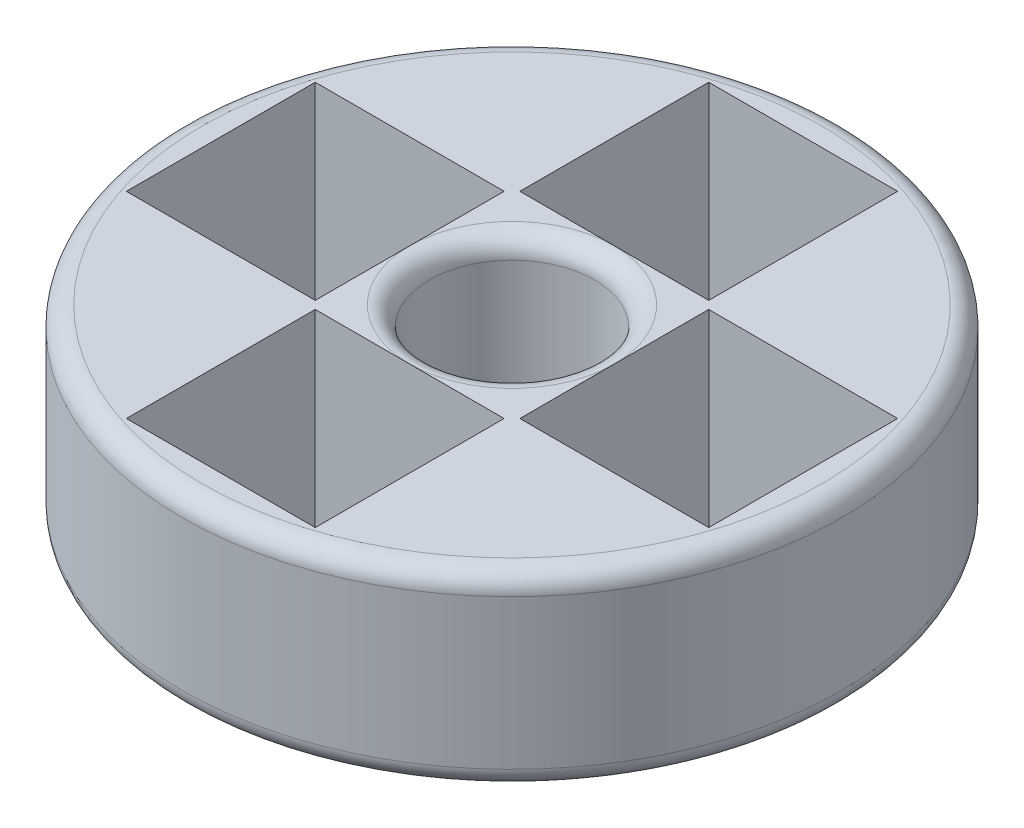
ISO-10303-21;
HEADER;
FILE_DESCRIPTION(('STEP AP214'),'2;1');
FILE_NAME('part.step','',(''),(''),'','','');
FILE_SCHEMA(('AUTOMOTIVE_DESIGN { 1 0 10303 214 1 1 1 1 }'));
ENDSEC;
DATA;
#1=APPLICATION_CONTEXT('core data for automotive mechanical design processes');
#2=APPLICATION_PROTOCOL_DEFINITION('international standard','automotive_design',2000,#1);
#3=PRODUCT_CONTEXT('',#1,'mechanical');
#4=PRODUCT('Part','Part','',(#3));
#5=PRODUCT_RELATED_PRODUCT_CATEGORY('part','',(#4));
#6=PRODUCT_DEFINITION_FORMATION('','',#4);
#7=PRODUCT_DEFINITION_CONTEXT('part definition',#1,'design');
#8=PRODUCT_DEFINITION('design','',#6,#7);
#9=PRODUCT_DEFINITION_SHAPE('','',#8);
#10=(LENGTH_UNIT() NAMED_UNIT(*) SI_UNIT(.MILLI.,.METRE.));
#11=(NAMED_UNIT(*) PLANE_ANGLE_UNIT() SI_UNIT($,.RADIAN.));
#12=(NAMED_UNIT(*) SI_UNIT($,.STERADIAN.) SOLID_ANGLE_UNIT());
#13=UNCERTAINTY_MEASURE_WITH_UNIT(LENGTH_MEASURE(1.E-05),#10,'distance_accuracy_value','');
#14=(GEOMETRIC_REPRESENTATION_CONTEXT(3) GLOBAL_UNCERTAINTY_ASSIGNED_CONTEXT((#13)) GLOBAL_UNIT_ASSIGNED_CONTEXT((#10,
#11,#12)) REPRESENTATION_CONTEXT('',''));
#15=CARTESIAN_POINT('',(0.,0.,0.));
#16=DIRECTION('',(0.,0.,1.));
#17=DIRECTION('',(1.,0.,0.));
#18=AXIS2_PLACEMENT_3D('',#15,#16,#17);
#19=CARTESIAN_POINT('',(0.,9.6,0.));
#20=DIRECTION('',(0.,1.,0.));
#21=DIRECTION('',(0.,0.,1.));
#22=AXIS2_PLACEMENT_3D('',#19,#20,#21);
#23=PLANE('',#22);
#24=CARTESIAN_POINT('',(0.,9.6,0.));
#25=DIRECTION('',(0.,1.,0.));
#26=DIRECTION('',(0.,0.,1.));
#27=AXIS2_PLACEMENT_3D('',#24,#25,#26);
#28=CIRCLE('',#27,15.75);
#29=CARTESIAN_POINT('',(0.,9.6,15.75));
#30=VERTEX_POINT('',#29);
#31=EDGE_CURVE('E336',#30,#30,#28,.T.);
#32=ORIENTED_EDGE('',*,*,#31,.T.);
#33=EDGE_LOOP('',(#32));
#34=FACE_BOUND('',#33,.T.);
#35=DIRECTION('',(-1.,0.,0.));
#36=VECTOR('',#35,1.);
#37=CARTESIAN_POINT('',(4.80000000000057,9.6,5.19999999999973));
#38=LINE('',#37,#36);
#39=CARTESIAN_POINT('',(0.,9.6,5.19999999999973));
#40=VERTEX_POINT('',#39);
#41=CARTESIAN_POINT('',(-4.79999999999943,9.6,5.19999999999973));
#42=VERTEX_POINT('',#41);
#43=EDGE_CURVE('E222',#40,#42,#38,.T.);
#44=ORIENTED_EDGE('',*,*,#43,.F.);
#45=CARTESIAN_POINT('',(0.,9.6,0.));
#46=DIRECTION('',(0.,1.,0.));
#47=DIRECTION('',(0.,0.,1.));
#48=AXIS2_PLACEMENT_3D('',#45,#46,#47);
#49=CIRCLE('',#48,5.2);
#50=CARTESIAN_POINT('',(-5.19999999999958,9.6,0.));
#51=VERTEX_POINT('',#50);
#52=EDGE_CURVE('E343',#40,#51,#49,.F.);
#53=ORIENTED_EDGE('',*,*,#52,.T.);
#54=DIRECTION('',(0.,0.,-1.));
#55=VECTOR('',#54,1.);
#56=CARTESIAN_POINT('',(-5.19999999999958,9.6,4.80000000000015));
#57=LINE('',#56,#55);
#58=CARTESIAN_POINT('',(-5.19999999999958,9.6,4.80000000000015));
#59=VERTEX_POINT('',#58);
#60=EDGE_CURVE('E196',#59,#51,#57,.T.);
#61=ORIENTED_EDGE('',*,*,#60,.F.);
#62=DIRECTION('',(1.,0.,0.));
#63=VECTOR('',#62,1.);
#64=CARTESIAN_POINT('',(-5.19999999999958,9.6,4.80000000000015));
#65=LINE('',#64,#63);
#66=CARTESIAN_POINT('',(-14.7999999999996,9.6,4.80000000000015));
#67=VERTEX_POINT('',#66);
#68=EDGE_CURVE('E183',#67,#59,#65,.T.);
#69=ORIENTED_EDGE('',*,*,#68,.F.);
#70=DIRECTION('',(0.,0.,1.));
#71=VECTOR('',#70,1.);
#72=CARTESIAN_POINT('',(-14.7999999999996,9.6,4.80000000000015));
#73=LINE('',#72,#71);
#74=CARTESIAN_POINT('',(-14.7999999999996,9.6,-4.79999999999985));
#75=VERTEX_POINT('',#74);
#76=EDGE_CURVE('E174',#75,#67,#73,.T.);
#77=ORIENTED_EDGE('',*,*,#76,.F.);
#78=DIRECTION('',(-1.,0.,0.));
#79=VECTOR('',#78,1.);
#80=CARTESIAN_POINT('',(-5.19999999999958,9.6,-4.79999999999985));
#81=LINE('',#80,#79);
#82=CARTESIAN_POINT('',(-5.19999999999958,9.6,-4.79999999999985));
#83=VERTEX_POINT('',#82);
#84=EDGE_CURVE('E201',#83,#75,#81,.T.);
#85=ORIENTED_EDGE('',*,*,#84,.F.);
#86=EDGE_CURVE('E197',#51,#83,#57,.T.);
#87=ORIENTED_EDGE('',*,*,#86,.F.);
#88=CARTESIAN_POINT('',(0.,9.6,0.));
#89=DIRECTION('',(0.,1.,0.));
#90=DIRECTION('',(0.,0.,1.));
#91=AXIS2_PLACEMENT_3D('',#88,#89,#90);
#92=CIRCLE('',#91,5.2);
#93=CARTESIAN_POINT('',(0.,9.6,-5.2));
#94=VERTEX_POINT('',#93);
#95=EDGE_CURVE('E48',#51,#94,#92,.F.);
#96=ORIENTED_EDGE('',*,*,#95,.T.);
#97=DIRECTION('',(1.,0.,0.));
#98=VECTOR('',#97,1.);
#99=CARTESIAN_POINT('',(-4.8,9.6,-5.2));
#100=LINE('',#99,#98);
#101=CARTESIAN_POINT('',(-4.8,9.6,-5.2));
#102=VERTEX_POINT('',#101);
#103=EDGE_CURVE('E294',#102,#94,#100,.T.);
#104=ORIENTED_EDGE('',*,*,#103,.F.);
#105=DIRECTION('',(0.,0.,1.));
#106=VECTOR('',#105,1.);
#107=CARTESIAN_POINT('',(-4.8,9.6,-5.2));
#108=LINE('',#107,#106);
#109=CARTESIAN_POINT('',(-4.8,9.6,-14.8));
#110=VERTEX_POINT('',#109);
#111=EDGE_CURVE('E290',#110,#102,#108,.T.);
#112=ORIENTED_EDGE('',*,*,#111,.F.);
#113=DIRECTION('',(-1.,0.,0.));
#114=VECTOR('',#113,1.);
#115=CARTESIAN_POINT('',(-4.8,9.6,-14.8));
#116=LINE('',#115,#114);
#117=CARTESIAN_POINT('',(4.8,9.6,-14.8));
#118=VERTEX_POINT('',#117);
#119=EDGE_CURVE('E287',#118,#110,#116,.T.);
#120=ORIENTED_EDGE('',*,*,#119,.F.);
#121=DIRECTION('',(0.,0.,-1.));
#122=VECTOR('',#121,1.);
#123=CARTESIAN_POINT('',(4.8,9.6,-5.2));
#124=LINE('',#123,#122);
#125=CARTESIAN_POINT('',(4.8,9.6,-5.2));
#126=VERTEX_POINT('',#125);
#127=EDGE_CURVE('E285',#126,#118,#124,.T.);
#128=ORIENTED_EDGE('',*,*,#127,.F.);
#129=EDGE_CURVE('E293',#94,#126,#100,.T.);
#130=ORIENTED_EDGE('',*,*,#129,.F.);
#131=CARTESIAN_POINT('',(0.,9.6,0.));
#132=DIRECTION('',(0.,1.,0.));
#133=DIRECTION('',(0.,0.,1.));
#134=AXIS2_PLACEMENT_3D('',#131,#132,#133);
#135=CIRCLE('',#134,5.2);
#136=CARTESIAN_POINT('',(5.20000000000015,9.6,0.));
#137=VERTEX_POINT('',#136);
#138=EDGE_CURVE('E340',#94,#137,#135,.F.);
#139=ORIENTED_EDGE('',*,*,#138,.T.);
#140=DIRECTION('',(0.,0.,1.));
#141=VECTOR('',#140,1.);
#142=CARTESIAN_POINT('',(5.20000000000015,9.6,-4.80000000000042));
#143=LINE('',#142,#141);
#144=CARTESIAN_POINT('',(5.20000000000015,9.6,-4.80000000000042));
#145=VERTEX_POINT('',#144);
#146=EDGE_CURVE('E257',#145,#137,#143,.T.);
#147=ORIENTED_EDGE('',*,*,#146,.F.);
#148=DIRECTION('',(-1.,0.,0.));
#149=VECTOR('',#148,1.);
#150=CARTESIAN_POINT('',(5.20000000000015,9.6,-4.80000000000042));
#151=LINE('',#150,#149);
#152=CARTESIAN_POINT('',(14.8000000000001,9.6,-4.80000000000042));
#153=VERTEX_POINT('',#152);
#154=EDGE_CURVE('E253',#153,#145,#151,.T.);
#155=ORIENTED_EDGE('',*,*,#154,.F.);
#156=DIRECTION('',(0.,0.,-1.));
#157=VECTOR('',#156,1.);
#158=CARTESIAN_POINT('',(14.8000000000001,9.6,-4.80000000000042));
#159=LINE('',#158,#157);
#160=CARTESIAN_POINT('',(14.8000000000001,9.6,4.79999999999958));
#161=VERTEX_POINT('',#160);
#162=EDGE_CURVE('E251',#161,#153,#159,.T.);
#163=ORIENTED_EDGE('',*,*,#162,.F.);
#164=DIRECTION('',(1.,0.,0.));
#165=VECTOR('',#164,1.);
#166=CARTESIAN_POINT('',(5.20000000000015,9.6,4.79999999999958));
#167=LINE('',#166,#165);
#168=CARTESIAN_POINT('',(5.20000000000015,9.6,4.79999999999958));
#169=VERTEX_POINT('',#168);
#170=EDGE_CURVE('E260',#169,#161,#167,.T.);
#171=ORIENTED_EDGE('',*,*,#170,.F.);
#172=EDGE_CURVE('E256',#137,#169,#143,.T.);
#173=ORIENTED_EDGE('',*,*,#172,.F.);
#174=CARTESIAN_POINT('',(0.,9.6,0.));
#175=DIRECTION('',(0.,1.,0.));
#176=DIRECTION('',(0.,0.,1.));
#177=AXIS2_PLACEMENT_3D('',#174,#175,#176);
#178=CIRCLE('',#177,5.2);
#179=EDGE_CURVE('E56',#137,#40,#178,.F.);
#180=ORIENTED_EDGE('',*,*,#179,.T.);
#181=CARTESIAN_POINT('',(4.80000000000057,9.6,5.19999999999973));
#182=VERTEX_POINT('',#181);
#183=EDGE_CURVE('E223',#182,#40,#38,.T.);
#184=ORIENTED_EDGE('',*,*,#183,.F.);
#185=DIRECTION('',(0.,0.,-1.));
#186=VECTOR('',#185,1.);
#187=CARTESIAN_POINT('',(4.80000000000057,9.6,5.19999999999973));
#188=LINE('',#187,#186);
#189=CARTESIAN_POINT('',(4.80000000000057,9.6,14.7999999999997));
#190=VERTEX_POINT('',#189);
#191=EDGE_CURVE('E219',#190,#182,#188,.T.);
#192=ORIENTED_EDGE('',*,*,#191,.F.);
#193=DIRECTION('',(1.,0.,0.));
#194=VECTOR('',#193,1.);
#195=CARTESIAN_POINT('',(4.80000000000057,9.6,14.7999999999997));
#196=LINE('',#195,#194);
#197=CARTESIAN_POINT('',(-4.79999999999943,9.6,14.7999999999997));
#198=VERTEX_POINT('',#197);
#199=EDGE_CURVE('E217',#198,#190,#196,.T.);
#200=ORIENTED_EDGE('',*,*,#199,.F.);
#201=DIRECTION('',(0.,0.,1.));
#202=VECTOR('',#201,1.);
#203=CARTESIAN_POINT('',(-4.79999999999943,9.6,5.19999999999973));
#204=LINE('',#203,#202);
#205=EDGE_CURVE('E226',#42,#198,#204,.T.);
#206=ORIENTED_EDGE('',*,*,#205,.F.);
#207=EDGE_LOOP('',(#44,#53,#61,#69,#77,#85,#87,#96,#104,#112,#120,#128,#130,#139,#147,#155,#163,
#171,#173,#180,#184,#192,#200,#206));
#208=FACE_BOUND('',#207,.T.);
#209=ADVANCED_FACE('F33',(#34,#208),#23,.T.);
#210=CARTESIAN_POINT('',(0.,0.,0.));
#211=DIRECTION('',(0.,1.,0.));
#212=DIRECTION('',(0.,0.,1.));
#213=AXIS2_PLACEMENT_3D('',#210,#211,#212);
#214=PLANE('',#213);
#215=CARTESIAN_POINT('',(0.,0.,0.));
#216=DIRECTION('',(0.,1.,0.));
#217=DIRECTION('',(0.,0.,1.));
#218=AXIS2_PLACEMENT_3D('',#215,#216,#217);
#219=CIRCLE('',#218,15.75);
#220=CARTESIAN_POINT('',(0.,0.,15.75));
#221=VERTEX_POINT('',#220);
#222=EDGE_CURVE('E318',#221,#221,#219,.F.);
#223=ORIENTED_EDGE('',*,*,#222,.T.);
#224=EDGE_LOOP('',(#223));
#225=FACE_BOUND('',#224,.T.);
#226=DIRECTION('',(-1.,0.,0.));
#227=VECTOR('',#226,1.);
#228=CARTESIAN_POINT('',(4.80000000000057,0.,5.19999999999973));
#229=LINE('',#228,#227);
#230=CARTESIAN_POINT('',(4.80000000000057,0.,5.19999999999973));
#231=VERTEX_POINT('',#230);
#232=CARTESIAN_POINT('',(0.,0.,5.19999999999973));
#233=VERTEX_POINT('',#232);
#234=EDGE_CURVE('E235',#231,#233,#229,.T.);
#235=ORIENTED_EDGE('',*,*,#234,.T.);
#236=CARTESIAN_POINT('',(0.,0.,0.));
#237=DIRECTION('',(0.,1.,0.));
#238=DIRECTION('',(0.,0.,1.));
#239=AXIS2_PLACEMENT_3D('',#236,#237,#238);
#240=CIRCLE('',#239,5.2);
#241=CARTESIAN_POINT('',(5.20000000000015,0.,0.));
#242=VERTEX_POINT('',#241);
#243=EDGE_CURVE('E327',#233,#242,#240,.T.);
#244=ORIENTED_EDGE('',*,*,#243,.T.);
#245=DIRECTION('',(0.,0.,1.));
#246=VECTOR('',#245,1.);
#247=CARTESIAN_POINT('',(5.20000000000015,0.,-4.80000000000042));
#248=LINE('',#247,#246);
#249=CARTESIAN_POINT('',(5.20000000000015,0.,4.79999999999958));
#250=VERTEX_POINT('',#249);
#251=EDGE_CURVE('E268',#242,#250,#248,.T.);
#252=ORIENTED_EDGE('',*,*,#251,.T.);
#253=DIRECTION('',(1.,0.,0.));
#254=VECTOR('',#253,1.);
#255=CARTESIAN_POINT('',(5.20000000000015,0.,4.79999999999958));
#256=LINE('',#255,#254);
#257=CARTESIAN_POINT('',(14.8000000000001,0.,4.79999999999958));
#258=VERTEX_POINT('',#257);
#259=EDGE_CURVE('E254',#250,#258,#256,.T.);
#260=ORIENTED_EDGE('',*,*,#259,.T.);
#261=DIRECTION('',(0.,0.,-1.));
#262=VECTOR('',#261,1.);
#263=CARTESIAN_POINT('',(14.8000000000001,0.,-4.80000000000042));
#264=LINE('',#263,#262);
#265=CARTESIAN_POINT('',(14.8000000000001,0.,-4.80000000000042));
#266=VERTEX_POINT('',#265);
#267=EDGE_CURVE('E250',#258,#266,#264,.T.);
#268=ORIENTED_EDGE('',*,*,#267,.T.);
#269=DIRECTION('',(-1.,0.,0.));
#270=VECTOR('',#269,1.);
#271=CARTESIAN_POINT('',(5.20000000000015,0.,-4.80000000000042));
#272=LINE('',#271,#270);
#273=CARTESIAN_POINT('',(5.20000000000015,0.,-4.80000000000042));
#274=VERTEX_POINT('',#273);
#275=EDGE_CURVE('E265',#266,#274,#272,.T.);
#276=ORIENTED_EDGE('',*,*,#275,.T.);
#277=EDGE_CURVE('E269',#274,#242,#248,.T.);
#278=ORIENTED_EDGE('',*,*,#277,.T.);
#279=CARTESIAN_POINT('',(0.,0.,0.));
#280=DIRECTION('',(0.,1.,0.));
#281=DIRECTION('',(0.,0.,1.));
#282=AXIS2_PLACEMENT_3D('',#279,#280,#281);
#283=CIRCLE('',#282,5.2);
#284=CARTESIAN_POINT('',(0.,0.,-5.2));
#285=VERTEX_POINT('',#284);
#286=EDGE_CURVE('E325',#242,#285,#283,.T.);
#287=ORIENTED_EDGE('',*,*,#286,.T.);
#288=DIRECTION('',(1.,0.,0.));
#289=VECTOR('',#288,1.);
#290=CARTESIAN_POINT('',(-4.8,0.,-5.2));
#291=LINE('',#290,#289);
#292=CARTESIAN_POINT('',(4.8,0.,-5.2));
#293=VERTEX_POINT('',#292);
#294=EDGE_CURVE('E306',#285,#293,#291,.T.);
#295=ORIENTED_EDGE('',*,*,#294,.T.);
#296=DIRECTION('',(0.,0.,-1.));
#297=VECTOR('',#296,1.);
#298=CARTESIAN_POINT('',(4.8,0.,-5.2));
#299=LINE('',#298,#297);
#300=CARTESIAN_POINT('',(4.8,0.,-14.8));
#301=VERTEX_POINT('',#300);
#302=EDGE_CURVE('E284',#293,#301,#299,.T.);
#303=ORIENTED_EDGE('',*,*,#302,.T.);
#304=DIRECTION('',(-1.,0.,0.));
#305=VECTOR('',#304,1.);
#306=CARTESIAN_POINT('',(-4.8,0.,-14.8));
#307=LINE('',#306,#305);
#308=CARTESIAN_POINT('',(-4.8,0.,-14.8));
#309=VERTEX_POINT('',#308);
#310=EDGE_CURVE('E300',#301,#309,#307,.T.);
#311=ORIENTED_EDGE('',*,*,#310,.T.);
#312=DIRECTION('',(0.,0.,1.));
#313=VECTOR('',#312,1.);
#314=CARTESIAN_POINT('',(-4.8,0.,-5.2));
#315=LINE('',#314,#313);
#316=CARTESIAN_POINT('',(-4.8,0.,-5.2));
#317=VERTEX_POINT('',#316);
#318=EDGE_CURVE('E303',#309,#317,#315,.T.);
#319=ORIENTED_EDGE('',*,*,#318,.T.);
#320=EDGE_CURVE('E288',#317,#285,#291,.T.);
#321=ORIENTED_EDGE('',*,*,#320,.T.);
#322=CARTESIAN_POINT('',(0.,0.,0.));
#323=DIRECTION('',(0.,1.,0.));
#324=DIRECTION('',(0.,0.,1.));
#325=AXIS2_PLACEMENT_3D('',#322,#323,#324);
#326=CIRCLE('',#325,5.2);
#327=CARTESIAN_POINT('',(-5.19999999999958,0.,0.));
#328=VERTEX_POINT('',#327);
#329=EDGE_CURVE('E323',#285,#328,#326,.T.);
#330=ORIENTED_EDGE('',*,*,#329,.T.);
#331=DIRECTION('',(0.,0.,-1.));
#332=VECTOR('',#331,1.);
#333=CARTESIAN_POINT('',(-5.19999999999958,0.,4.80000000000015));
#334=LINE('',#333,#332);
#335=CARTESIAN_POINT('',(-5.19999999999958,0.,-4.79999999999985));
#336=VERTEX_POINT('',#335);
#337=EDGE_CURVE('E206',#328,#336,#334,.T.);
#338=ORIENTED_EDGE('',*,*,#337,.T.);
#339=DIRECTION('',(-1.,0.,0.));
#340=VECTOR('',#339,1.);
#341=CARTESIAN_POINT('',(-5.19999999999958,0.,-4.79999999999985));
#342=LINE('',#341,#340);
#343=CARTESIAN_POINT('',(-14.7999999999996,0.,-4.79999999999985));
#344=VERTEX_POINT('',#343);
#345=EDGE_CURVE('E184',#336,#344,#342,.T.);
#346=ORIENTED_EDGE('',*,*,#345,.T.);
#347=DIRECTION('',(0.,0.,1.));
#348=VECTOR('',#347,1.);
#349=CARTESIAN_POINT('',(-14.7999999999996,0.,4.80000000000015));
#350=LINE('',#349,#348);
#351=CARTESIAN_POINT('',(-14.7999999999996,0.,4.80000000000015));
#352=VERTEX_POINT('',#351);
#353=EDGE_CURVE('E203',#344,#352,#350,.T.);
#354=ORIENTED_EDGE('',*,*,#353,.T.);
#355=DIRECTION('',(1.,0.,0.));
#356=VECTOR('',#355,1.);
#357=CARTESIAN_POINT('',(-5.19999999999958,0.,4.80000000000015));
#358=LINE('',#357,#356);
#359=CARTESIAN_POINT('',(-5.19999999999958,0.,4.80000000000015));
#360=VERTEX_POINT('',#359);
#361=EDGE_CURVE('E190',#352,#360,#358,.T.);
#362=ORIENTED_EDGE('',*,*,#361,.T.);
#363=EDGE_CURVE('E207',#360,#328,#334,.T.);
#364=ORIENTED_EDGE('',*,*,#363,.T.);
#365=CARTESIAN_POINT('',(0.,0.,0.));
#366=DIRECTION('',(0.,1.,0.));
#367=DIRECTION('',(0.,0.,1.));
#368=AXIS2_PLACEMENT_3D('',#365,#366,#367);
#369=CIRCLE('',#368,5.2);
#370=EDGE_CURVE('E321',#328,#233,#369,.T.);
#371=ORIENTED_EDGE('',*,*,#370,.T.);
#372=CARTESIAN_POINT('',(-4.79999999999943,0.,5.19999999999973));
#373=VERTEX_POINT('',#372);
#374=EDGE_CURVE('E234',#233,#373,#229,.T.);
#375=ORIENTED_EDGE('',*,*,#374,.T.);
#376=DIRECTION('',(0.,0.,1.));
#377=VECTOR('',#376,1.);
#378=CARTESIAN_POINT('',(-4.79999999999943,0.,5.19999999999973));
#379=LINE('',#378,#377);
#380=CARTESIAN_POINT('',(-4.79999999999943,0.,14.7999999999997));
#381=VERTEX_POINT('',#380);
#382=EDGE_CURVE('E220',#373,#381,#379,.T.);
#383=ORIENTED_EDGE('',*,*,#382,.T.);
#384=DIRECTION('',(1.,0.,0.));
#385=VECTOR('',#384,1.);
#386=CARTESIAN_POINT('',(4.80000000000057,0.,14.7999999999997));
#387=LINE('',#386,#385);
#388=CARTESIAN_POINT('',(4.80000000000057,0.,14.7999999999997));
#389=VERTEX_POINT('',#388);
#390=EDGE_CURVE('E191',#381,#389,#387,.T.);
#391=ORIENTED_EDGE('',*,*,#390,.T.);
#392=DIRECTION('',(0.,0.,-1.));
#393=VECTOR('',#392,1.);
#394=CARTESIAN_POINT('',(4.80000000000057,0.,5.19999999999973));
#395=LINE('',#394,#393);
#396=EDGE_CURVE('E231',#389,#231,#395,.T.);
#397=ORIENTED_EDGE('',*,*,#396,.T.);
#398=EDGE_LOOP('',(#235,#244,#252,#260,#268,#276,#278,#287,#295,#303,#311,#319,#321,#330,#338,
#346,#354,#362,#364,#371,#375,#383,#391,#397));
#399=FACE_BOUND('',#398,.T.);
#400=ADVANCED_FACE('F355',(#225,#399),#214,.F.);
#401=CARTESIAN_POINT('',(0.,9.6,0.));
#402=DIRECTION('',(0.,-1.,0.));
#403=DIRECTION('',(0.,0.,-1.));
#404=AXIS2_PLACEMENT_3D('',#401,#402,#403);
#405=CYLINDRICAL_SURFACE('',#404,16.75);
#406=CARTESIAN_POINT('',(0.,0.999999999999999,0.));
#407=DIRECTION('',(0.,1.,0.));
#408=DIRECTION('',(0.,0.,1.));
#409=AXIS2_PLACEMENT_3D('',#406,#407,#408);
#410=CIRCLE('',#409,16.75);
#411=CARTESIAN_POINT('',(0.,0.999999999999999,16.75));
#412=VERTEX_POINT('',#411);
#413=EDGE_CURVE('E11',#412,#412,#410,.T.);
#414=ORIENTED_EDGE('',*,*,#413,.T.);
#415=EDGE_LOOP('',(#414));
#416=FACE_BOUND('',#415,.T.);
#417=CARTESIAN_POINT('',(0.,8.6,0.));
#418=DIRECTION('',(0.,1.,0.));
#419=DIRECTION('',(0.,0.,1.));
#420=AXIS2_PLACEMENT_3D('',#417,#418,#419);
#421=CIRCLE('',#420,16.75);
#422=CARTESIAN_POINT('',(0.,8.6,16.75));
#423=VERTEX_POINT('',#422);
#424=EDGE_CURVE('E41',#423,#423,#421,.F.);
#425=ORIENTED_EDGE('',*,*,#424,.T.);
#426=EDGE_LOOP('',(#425));
#427=FACE_BOUND('',#426,.T.);
#428=ADVANCED_FACE('F347',(#416,#427),#405,.T.);
#429=CARTESIAN_POINT('',(4.8,9.6,-5.2));
#430=DIRECTION('',(-1.,0.,0.));
#431=DIRECTION('',(0.,0.,1.));
#432=AXIS2_PLACEMENT_3D('',#429,#430,#431);
#433=PLANE('',#432);
#434=ORIENTED_EDGE('',*,*,#302,.F.);
#435=DIRECTION('',(0.,-1.,0.));
#436=VECTOR('',#435,1.);
#437=CARTESIAN_POINT('',(4.8,9.6,-5.2));
#438=LINE('',#437,#436);
#439=EDGE_CURVE('E297',#126,#293,#438,.T.);
#440=ORIENTED_EDGE('',*,*,#439,.F.);
#441=ORIENTED_EDGE('',*,*,#127,.T.);
#442=DIRECTION('',(0.,-1.,0.));
#443=VECTOR('',#442,1.);
#444=CARTESIAN_POINT('',(4.8,9.6,-14.8));
#445=LINE('',#444,#443);
#446=EDGE_CURVE('E315',#118,#301,#445,.T.);
#447=ORIENTED_EDGE('',*,*,#446,.T.);
#448=EDGE_LOOP('',(#434,#440,#441,#447));
#449=FACE_BOUND('',#448,.T.);
#450=ADVANCED_FACE('F363',(#449),#433,.T.);
#451=CARTESIAN_POINT('',(-4.8,9.6,-14.8));
#452=DIRECTION('',(0.,0.,1.));
#453=DIRECTION('',(1.,0.,0.));
#454=AXIS2_PLACEMENT_3D('',#451,#452,#453);
#455=PLANE('',#454);
#456=ORIENTED_EDGE('',*,*,#310,.F.);
#457=ORIENTED_EDGE('',*,*,#446,.F.);
#458=ORIENTED_EDGE('',*,*,#119,.T.);
#459=DIRECTION('',(0.,-1.,0.));
#460=VECTOR('',#459,1.);
#461=CARTESIAN_POINT('',(-4.8,9.6,-14.8));
#462=LINE('',#461,#460);
#463=EDGE_CURVE('E313',#110,#309,#462,.T.);
#464=ORIENTED_EDGE('',*,*,#463,.T.);
#465=EDGE_LOOP('',(#456,#457,#458,#464));
#466=FACE_BOUND('',#465,.T.);
#467=ADVANCED_FACE('F451',(#466),#455,.T.);
#468=CARTESIAN_POINT('',(-4.8,9.6,-5.2));
#469=DIRECTION('',(1.,0.,0.));
#470=DIRECTION('',(0.,0.,-1.));
#471=AXIS2_PLACEMENT_3D('',#468,#469,#470);
#472=PLANE('',#471);
#473=ORIENTED_EDGE('',*,*,#318,.F.);
#474=ORIENTED_EDGE('',*,*,#463,.F.);
#475=ORIENTED_EDGE('',*,*,#111,.T.);
#476=DIRECTION('',(0.,-1.,0.));
#477=VECTOR('',#476,1.);
#478=CARTESIAN_POINT('',(-4.8,9.6,-5.2));
#479=LINE('',#478,#477);
#480=EDGE_CURVE('E311',#102,#317,#479,.T.);
#481=ORIENTED_EDGE('',*,*,#480,.T.);
#482=EDGE_LOOP('',(#473,#474,#475,#481));
#483=FACE_BOUND('',#482,.T.);
#484=ADVANCED_FACE('F404',(#483),#472,.T.);
#485=CARTESIAN_POINT('',(-4.8,9.6,-5.2));
#486=DIRECTION('',(0.,0.,-1.));
#487=DIRECTION('',(-1.,0.,0.));
#488=AXIS2_PLACEMENT_3D('',#485,#486,#487);
#489=PLANE('',#488);
#490=ORIENTED_EDGE('',*,*,#320,.F.);
#491=ORIENTED_EDGE('',*,*,#480,.F.);
#492=ORIENTED_EDGE('',*,*,#103,.T.);
#493=ORIENTED_EDGE('',*,*,#129,.T.);
#494=ORIENTED_EDGE('',*,*,#439,.T.);
#495=ORIENTED_EDGE('',*,*,#294,.F.);
#496=EDGE_LOOP('',(#490,#491,#492,#493,#494,#495));
#497=FACE_BOUND('',#496,.T.);
#498=ADVANCED_FACE('F398',(#497),#489,.T.);
#499=CARTESIAN_POINT('',(0.,9.6,0.));
#500=DIRECTION('',(0.,-1.,0.));
#501=DIRECTION('',(0.,0.,-1.));
#502=AXIS2_PLACEMENT_3D('',#499,#500,#501);
#503=CYLINDRICAL_SURFACE('',#502,4.2);
#504=CARTESIAN_POINT('',(0.,0.999999999999999,0.));
#505=DIRECTION('',(0.,1.,0.));
#506=DIRECTION('',(0.,0.,1.));
#507=AXIS2_PLACEMENT_3D('',#504,#505,#506);
#508=CIRCLE('',#507,4.2);
#509=CARTESIAN_POINT('',(0.,0.999999999999999,4.2));
#510=VERTEX_POINT('',#509);
#511=EDGE_CURVE('E333',#510,#510,#508,.F.);
#512=ORIENTED_EDGE('',*,*,#511,.T.);
#513=EDGE_LOOP('',(#512));
#514=FACE_BOUND('',#513,.T.);
#515=CARTESIAN_POINT('',(0.,8.6,0.));
#516=DIRECTION('',(0.,1.,0.));
#517=DIRECTION('',(0.,0.,1.));
#518=AXIS2_PLACEMENT_3D('',#515,#516,#517);
#519=CIRCLE('',#518,4.2);
#520=CARTESIAN_POINT('',(0.,8.6,4.2));
#521=VERTEX_POINT('',#520);
#522=EDGE_CURVE('E330',#521,#521,#519,.T.);
#523=ORIENTED_EDGE('',*,*,#522,.T.);
#524=EDGE_LOOP('',(#523));
#525=FACE_BOUND('',#524,.T.);
#526=ADVANCED_FACE('F444',(#514,#525),#503,.F.);
#527=CARTESIAN_POINT('',(14.8000000000001,9.6,-4.80000000000042));
#528=DIRECTION('',(-1.,0.,0.));
#529=DIRECTION('',(0.,0.,1.));
#530=AXIS2_PLACEMENT_3D('',#527,#528,#529);
#531=PLANE('',#530);
#532=ORIENTED_EDGE('',*,*,#267,.F.);
#533=DIRECTION('',(0.,-1.,0.));
#534=VECTOR('',#533,1.);
#535=CARTESIAN_POINT('',(14.8000000000001,9.6,4.79999999999958));
#536=LINE('',#535,#534);
#537=EDGE_CURVE('E262',#161,#258,#536,.T.);
#538=ORIENTED_EDGE('',*,*,#537,.F.);
#539=ORIENTED_EDGE('',*,*,#162,.T.);
#540=DIRECTION('',(0.,-1.,0.));
#541=VECTOR('',#540,1.);
#542=CARTESIAN_POINT('',(14.8000000000001,9.6,-4.80000000000042));
#543=LINE('',#542,#541);
#544=EDGE_CURVE('E281',#153,#266,#543,.T.);
#545=ORIENTED_EDGE('',*,*,#544,.T.);
#546=EDGE_LOOP('',(#532,#538,#539,#545));
#547=FACE_BOUND('',#546,.T.);
#548=ADVANCED_FACE('F423',(#547),#531,.T.);
#549=CARTESIAN_POINT('',(5.20000000000015,9.6,-4.80000000000042));
#550=DIRECTION('',(0.,0.,1.));
#551=DIRECTION('',(1.,0.,0.));
#552=AXIS2_PLACEMENT_3D('',#549,#550,#551);
#553=PLANE('',#552);
#554=ORIENTED_EDGE('',*,*,#275,.F.);
#555=ORIENTED_EDGE('',*,*,#544,.F.);
#556=ORIENTED_EDGE('',*,*,#154,.T.);
#557=DIRECTION('',(0.,-1.,0.));
#558=VECTOR('',#557,1.);
#559=CARTESIAN_POINT('',(5.20000000000015,9.6,-4.80000000000042));
#560=LINE('',#559,#558);
#561=EDGE_CURVE('E279',#145,#274,#560,.T.);
#562=ORIENTED_EDGE('',*,*,#561,.T.);
#563=EDGE_LOOP('',(#554,#555,#556,#562));
#564=FACE_BOUND('',#563,.T.);
#565=ADVANCED_FACE('F419',(#564),#553,.T.);
#566=CARTESIAN_POINT('',(5.20000000000015,9.6,-4.80000000000042));
#567=DIRECTION('',(1.,0.,0.));
#568=DIRECTION('',(0.,0.,-1.));
#569=AXIS2_PLACEMENT_3D('',#566,#567,#568);
#570=PLANE('',#569);
#571=ORIENTED_EDGE('',*,*,#277,.F.);
#572=ORIENTED_EDGE('',*,*,#561,.F.);
#573=ORIENTED_EDGE('',*,*,#146,.T.);
#574=ORIENTED_EDGE('',*,*,#172,.T.);
#575=DIRECTION('',(0.,-1.,0.));
#576=VECTOR('',#575,1.);
#577=CARTESIAN_POINT('',(5.20000000000015,9.6,4.79999999999958));
#578=LINE('',#577,#576);
#579=EDGE_CURVE('E276',#169,#250,#578,.T.);
#580=ORIENTED_EDGE('',*,*,#579,.T.);
#581=ORIENTED_EDGE('',*,*,#251,.F.);
#582=EDGE_LOOP('',(#571,#572,#573,#574,#580,#581));
#583=FACE_BOUND('',#582,.T.);
#584=ADVANCED_FACE('F417',(#583),#570,.T.);
#585=CARTESIAN_POINT('',(5.20000000000015,9.6,4.79999999999958));
#586=DIRECTION('',(0.,0.,-1.));
#587=DIRECTION('',(-1.,0.,0.));
#588=AXIS2_PLACEMENT_3D('',#585,#586,#587);
#589=PLANE('',#588);
#590=ORIENTED_EDGE('',*,*,#259,.F.);
#591=ORIENTED_EDGE('',*,*,#579,.F.);
#592=ORIENTED_EDGE('',*,*,#170,.T.);
#593=ORIENTED_EDGE('',*,*,#537,.T.);
#594=EDGE_LOOP('',(#590,#591,#592,#593));
#595=FACE_BOUND('',#594,.T.);
#596=ADVANCED_FACE('F426',(#595),#589,.T.);
#597=CARTESIAN_POINT('',(4.80000000000057,9.6,14.7999999999997));
#598=DIRECTION('',(0.,0.,-1.));
#599=DIRECTION('',(-1.,0.,0.));
#600=AXIS2_PLACEMENT_3D('',#597,#598,#599);
#601=PLANE('',#600);
#602=ORIENTED_EDGE('',*,*,#390,.F.);
#603=DIRECTION('',(0.,-1.,0.));
#604=VECTOR('',#603,1.);
#605=CARTESIAN_POINT('',(-4.79999999999943,9.6,14.7999999999997));
#606=LINE('',#605,#604);
#607=EDGE_CURVE('E228',#198,#381,#606,.T.);
#608=ORIENTED_EDGE('',*,*,#607,.F.);
#609=ORIENTED_EDGE('',*,*,#199,.T.);
#610=DIRECTION('',(0.,-1.,0.));
#611=VECTOR('',#610,1.);
#612=CARTESIAN_POINT('',(4.80000000000057,9.6,14.7999999999997));
#613=LINE('',#612,#611);
#614=EDGE_CURVE('E247',#190,#389,#613,.T.);
#615=ORIENTED_EDGE('',*,*,#614,.T.);
#616=EDGE_LOOP('',(#602,#608,#609,#615));
#617=FACE_BOUND('',#616,.T.);
#618=ADVANCED_FACE('F428',(#617),#601,.T.);
#619=CARTESIAN_POINT('',(4.80000000000057,9.6,5.19999999999973));
#620=DIRECTION('',(-1.,0.,0.));
#621=DIRECTION('',(0.,0.,1.));
#622=AXIS2_PLACEMENT_3D('',#619,#620,#621);
#623=PLANE('',#622);
#624=ORIENTED_EDGE('',*,*,#396,.F.);
#625=ORIENTED_EDGE('',*,*,#614,.F.);
#626=ORIENTED_EDGE('',*,*,#191,.T.);
#627=DIRECTION('',(0.,-1.,0.));
#628=VECTOR('',#627,1.);
#629=CARTESIAN_POINT('',(4.80000000000057,9.6,5.19999999999973));
#630=LINE('',#629,#628);
#631=EDGE_CURVE('E245',#182,#231,#630,.T.);
#632=ORIENTED_EDGE('',*,*,#631,.T.);
#633=EDGE_LOOP('',(#624,#625,#626,#632));
#634=FACE_BOUND('',#633,.T.);
#635=ADVANCED_FACE('F434',(#634),#623,.T.);
#636=CARTESIAN_POINT('',(4.80000000000057,9.6,5.19999999999973));
#637=DIRECTION('',(0.,0.,1.));
#638=DIRECTION('',(1.,0.,0.));
#639=AXIS2_PLACEMENT_3D('',#636,#637,#638);
#640=PLANE('',#639);
#641=ORIENTED_EDGE('',*,*,#234,.F.);
#642=ORIENTED_EDGE('',*,*,#631,.F.);
#643=ORIENTED_EDGE('',*,*,#183,.T.);
#644=ORIENTED_EDGE('',*,*,#43,.T.);
#645=DIRECTION('',(0.,-1.,0.));
#646=VECTOR('',#645,1.);
#647=CARTESIAN_POINT('',(-4.79999999999943,9.6,5.19999999999973));
#648=LINE('',#647,#646);
#649=EDGE_CURVE('E242',#42,#373,#648,.T.);
#650=ORIENTED_EDGE('',*,*,#649,.T.);
#651=ORIENTED_EDGE('',*,*,#374,.F.);
#652=EDGE_LOOP('',(#641,#642,#643,#644,#650,#651));
#653=FACE_BOUND('',#652,.T.);
#654=ADVANCED_FACE('F514',(#653),#640,.T.);
#655=CARTESIAN_POINT('',(-4.79999999999943,9.6,5.19999999999973));
#656=DIRECTION('',(1.,0.,0.));
#657=DIRECTION('',(0.,0.,-1.));
#658=AXIS2_PLACEMENT_3D('',#655,#656,#657);
#659=PLANE('',#658);
#660=ORIENTED_EDGE('',*,*,#382,.F.);
#661=ORIENTED_EDGE('',*,*,#649,.F.);
#662=ORIENTED_EDGE('',*,*,#205,.T.);
#663=ORIENTED_EDGE('',*,*,#607,.T.);
#664=EDGE_LOOP('',(#660,#661,#662,#663));
#665=FACE_BOUND('',#664,.T.);
#666=ADVANCED_FACE('F505',(#665),#659,.T.);
#667=CARTESIAN_POINT('',(-14.7999999999996,9.6,4.80000000000015));
#668=DIRECTION('',(1.,0.,0.));
#669=DIRECTION('',(0.,0.,-1.));
#670=AXIS2_PLACEMENT_3D('',#667,#668,#669);
#671=PLANE('',#670);
#672=ORIENTED_EDGE('',*,*,#353,.F.);
#673=DIRECTION('',(0.,-1.,0.));
#674=VECTOR('',#673,1.);
#675=CARTESIAN_POINT('',(-14.7999999999996,9.6,-4.79999999999985));
#676=LINE('',#675,#674);
#677=EDGE_CURVE('E180',#75,#344,#676,.T.);
#678=ORIENTED_EDGE('',*,*,#677,.F.);
#679=ORIENTED_EDGE('',*,*,#76,.T.);
#680=DIRECTION('',(0.,-1.,0.));
#681=VECTOR('',#680,1.);
#682=CARTESIAN_POINT('',(-14.7999999999996,9.6,4.80000000000015));
#683=LINE('',#682,#681);
#684=EDGE_CURVE('E177',#67,#352,#683,.T.);
#685=ORIENTED_EDGE('',*,*,#684,.T.);
#686=EDGE_LOOP('',(#672,#678,#679,#685));
#687=FACE_BOUND('',#686,.T.);
#688=ADVANCED_FACE('F176',(#687),#671,.T.);
#689=CARTESIAN_POINT('',(-5.19999999999958,9.6,4.80000000000015));
#690=DIRECTION('',(0.,0.,-1.));
#691=DIRECTION('',(-1.,0.,0.));
#692=AXIS2_PLACEMENT_3D('',#689,#690,#691);
#693=PLANE('',#692);
#694=ORIENTED_EDGE('',*,*,#361,.F.);
#695=ORIENTED_EDGE('',*,*,#684,.F.);
#696=ORIENTED_EDGE('',*,*,#68,.T.);
#697=DIRECTION('',(0.,-1.,0.));
#698=VECTOR('',#697,1.);
#699=CARTESIAN_POINT('',(-5.19999999999958,9.6,4.80000000000015));
#700=LINE('',#699,#698);
#701=EDGE_CURVE('E192',#59,#360,#700,.T.);
#702=ORIENTED_EDGE('',*,*,#701,.T.);
#703=EDGE_LOOP('',(#694,#695,#696,#702));
#704=FACE_BOUND('',#703,.T.);
#705=ADVANCED_FACE('F187',(#704),#693,.T.);
#706=CARTESIAN_POINT('',(-5.19999999999958,9.6,4.80000000000015));
#707=DIRECTION('',(-1.,0.,0.));
#708=DIRECTION('',(0.,0.,1.));
#709=AXIS2_PLACEMENT_3D('',#706,#707,#708);
#710=PLANE('',#709);
#711=ORIENTED_EDGE('',*,*,#363,.F.);
#712=ORIENTED_EDGE('',*,*,#701,.F.);
#713=ORIENTED_EDGE('',*,*,#60,.T.);
#714=ORIENTED_EDGE('',*,*,#86,.T.);
#715=DIRECTION('',(0.,-1.,0.));
#716=VECTOR('',#715,1.);
#717=CARTESIAN_POINT('',(-5.19999999999958,9.6,-4.79999999999985));
#718=LINE('',#717,#716);
#719=EDGE_CURVE('E213',#83,#336,#718,.T.);
#720=ORIENTED_EDGE('',*,*,#719,.T.);
#721=ORIENTED_EDGE('',*,*,#337,.F.);
#722=EDGE_LOOP('',(#711,#712,#713,#714,#720,#721));
#723=FACE_BOUND('',#722,.T.);
#724=ADVANCED_FACE('F484',(#723),#710,.T.);
#725=CARTESIAN_POINT('',(-5.19999999999958,9.6,-4.79999999999985));
#726=DIRECTION('',(0.,0.,1.));
#727=DIRECTION('',(1.,0.,0.));
#728=AXIS2_PLACEMENT_3D('',#725,#726,#727);
#729=PLANE('',#728);
#730=ORIENTED_EDGE('',*,*,#345,.F.);
#731=ORIENTED_EDGE('',*,*,#719,.F.);
#732=ORIENTED_EDGE('',*,*,#84,.T.);
#733=ORIENTED_EDGE('',*,*,#677,.T.);
#734=EDGE_LOOP('',(#730,#731,#732,#733));
#735=FACE_BOUND('',#734,.T.);
#736=ADVANCED_FACE('F373',(#735),#729,.T.);
#737=CARTESIAN_POINT('',(0.,0.999999999999999,0.));
#738=DIRECTION('',(0.,1.,0.));
#739=DIRECTION('',(0.,0.,1.));
#740=AXIS2_PLACEMENT_3D('',#737,#738,#739);
#741=TOROIDAL_SURFACE('',#740,5.2,1.);
#742=ORIENTED_EDGE('',*,*,#511,.F.);
#743=EDGE_LOOP('',(#742));
#744=FACE_BOUND('',#743,.T.);
#745=ORIENTED_EDGE('',*,*,#286,.F.);
#746=ORIENTED_EDGE('',*,*,#243,.F.);
#747=ORIENTED_EDGE('',*,*,#370,.F.);
#748=ORIENTED_EDGE('',*,*,#329,.F.);
#749=EDGE_LOOP('',(#745,#746,#747,#748));
#750=FACE_BOUND('',#749,.T.);
#751=ADVANCED_FACE('F369',(#744,#750),#741,.T.);
#752=CARTESIAN_POINT('',(0.,8.6,0.));
#753=DIRECTION('',(0.,1.,0.));
#754=DIRECTION('',(0.,0.,1.));
#755=AXIS2_PLACEMENT_3D('',#752,#753,#754);
#756=TOROIDAL_SURFACE('',#755,5.2,1.);
#757=ORIENTED_EDGE('',*,*,#95,.F.);
#758=ORIENTED_EDGE('',*,*,#52,.F.);
#759=ORIENTED_EDGE('',*,*,#179,.F.);
#760=ORIENTED_EDGE('',*,*,#138,.F.);
#761=EDGE_LOOP('',(#757,#758,#759,#760));
#762=FACE_BOUND('',#761,.T.);
#763=ORIENTED_EDGE('',*,*,#522,.F.);
#764=EDGE_LOOP('',(#763));
#765=FACE_BOUND('',#764,.T.);
#766=ADVANCED_FACE('F372',(#762,#765),#756,.T.);
#767=CARTESIAN_POINT('',(0.,0.999999999999999,0.));
#768=DIRECTION('',(0.,1.,0.));
#769=DIRECTION('',(0.,0.,1.));
#770=AXIS2_PLACEMENT_3D('',#767,#768,#769);
#771=TOROIDAL_SURFACE('',#770,15.75,1.);
#772=ORIENTED_EDGE('',*,*,#222,.F.);
#773=EDGE_LOOP('',(#772));
#774=FACE_BOUND('',#773,.T.);
#775=ORIENTED_EDGE('',*,*,#413,.F.);
#776=EDGE_LOOP('',(#775));
#777=FACE_BOUND('',#776,.T.);
#778=ADVANCED_FACE('F351',(#774,#777),#771,.T.);
#779=CARTESIAN_POINT('',(0.,8.6,0.));
#780=DIRECTION('',(0.,1.,0.));
#781=DIRECTION('',(0.,0.,1.));
#782=AXIS2_PLACEMENT_3D('',#779,#780,#781);
#783=TOROIDAL_SURFACE('',#782,15.75,1.);
#784=ORIENTED_EDGE('',*,*,#424,.F.);
#785=EDGE_LOOP('',(#784));
#786=FACE_BOUND('',#785,.T.);
#787=ORIENTED_EDGE('',*,*,#31,.F.);
#788=EDGE_LOOP('',(#787));
#789=FACE_BOUND('',#788,.T.);
#790=ADVANCED_FACE('F35',(#786,#789),#783,.T.);
#791=CLOSED_SHELL('',(#209,#400,#428,#450,#467,#484,#498,#526,#548,#565,#584,#596,#618,#635,
#654,#666,#688,#705,#724,#736,#751,#766,#778,#790));
#792=MANIFOLD_SOLID_BREP('B2',#791);
#793=ADVANCED_BREP_SHAPE_REPRESENTATION('',(#18,#792),#14);
#794=SHAPE_DEFINITION_REPRESENTATION(#9,#793);
ENDSEC;
END-ISO-10303-21;
